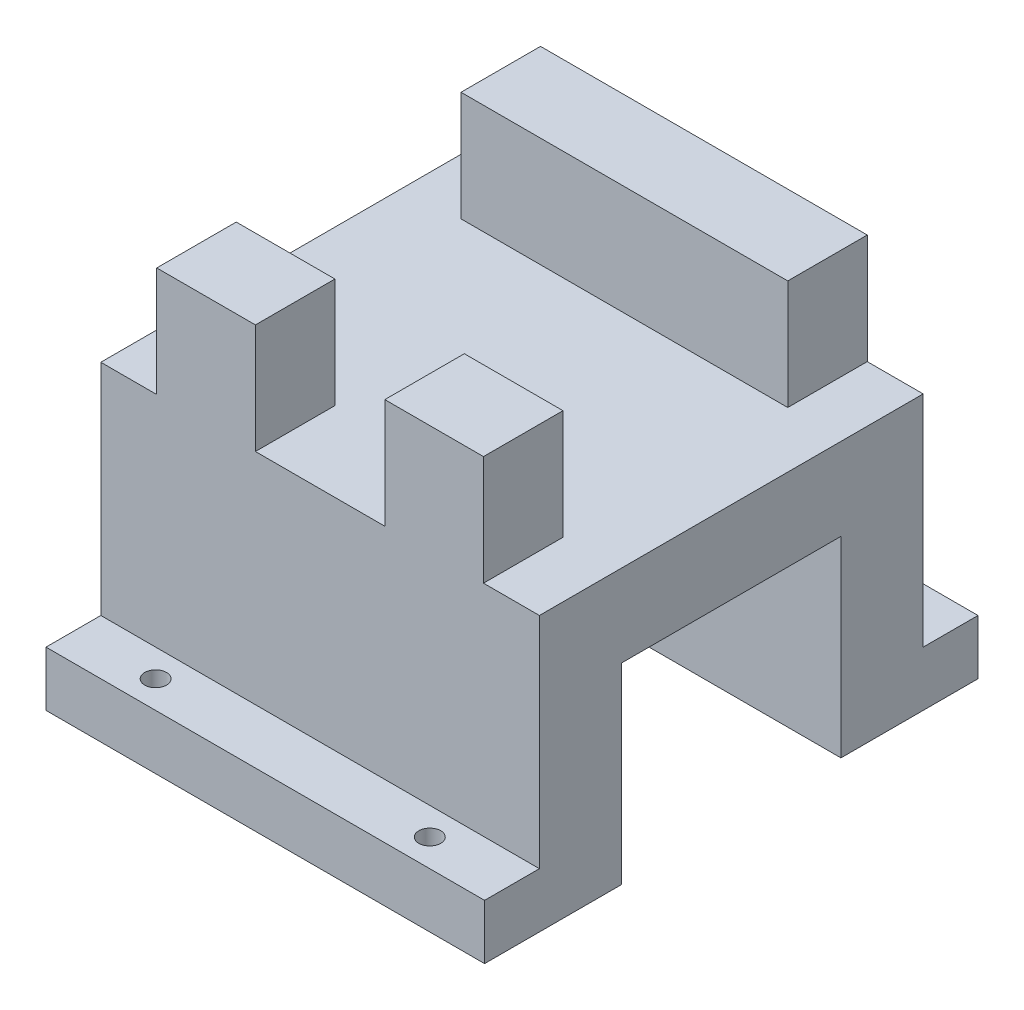
ISO-10303-21;
HEADER;
FILE_DESCRIPTION(('STEP AP214'),'2;1');
FILE_NAME('part.step','',(''),(''),'','','');
FILE_SCHEMA(('AUTOMOTIVE_DESIGN { 1 0 10303 214 1 1 1 1 }'));
ENDSEC;
DATA;
#1=APPLICATION_CONTEXT('core data for automotive mechanical design processes');
#2=APPLICATION_PROTOCOL_DEFINITION('international standard','automotive_design',2000,#1);
#3=PRODUCT_CONTEXT('',#1,'mechanical');
#4=PRODUCT('Part','Part','',(#3));
#5=PRODUCT_RELATED_PRODUCT_CATEGORY('part','',(#4));
#6=PRODUCT_DEFINITION_FORMATION('','',#4);
#7=PRODUCT_DEFINITION_CONTEXT('part definition',#1,'design');
#8=PRODUCT_DEFINITION('design','',#6,#7);
#9=PRODUCT_DEFINITION_SHAPE('','',#8);
#10=(LENGTH_UNIT() NAMED_UNIT(*) SI_UNIT(.MILLI.,.METRE.));
#11=(NAMED_UNIT(*) PLANE_ANGLE_UNIT() SI_UNIT($,.RADIAN.));
#12=(NAMED_UNIT(*) SI_UNIT($,.STERADIAN.) SOLID_ANGLE_UNIT());
#13=UNCERTAINTY_MEASURE_WITH_UNIT(LENGTH_MEASURE(1.E-05),#10,'distance_accuracy_value','');
#14=(GEOMETRIC_REPRESENTATION_CONTEXT(3) GLOBAL_UNCERTAINTY_ASSIGNED_CONTEXT((#13)) GLOBAL_UNIT_ASSIGNED_CONTEXT((#10,
#11,#12)) REPRESENTATION_CONTEXT('',''));
#15=CARTESIAN_POINT('',(0.,0.,0.));
#16=DIRECTION('',(0.,0.,1.));
#17=DIRECTION('',(1.,0.,0.));
#18=AXIS2_PLACEMENT_3D('',#15,#16,#17);
#19=CARTESIAN_POINT('',(0.,0.,0.));
#20=DIRECTION('',(0.,-1.,0.));
#21=DIRECTION('',(0.,0.,-1.));
#22=AXIS2_PLACEMENT_3D('',#19,#20,#21);
#23=PLANE('',#22);
#24=CARTESIAN_POINT('',(-25.,0.,-40.));
#25=DIRECTION('',(0.,-1.,0.));
#26=DIRECTION('',(0.,0.,-1.));
#27=AXIS2_PLACEMENT_3D('',#24,#25,#26);
#28=CIRCLE('',#27,2.);
#29=CARTESIAN_POINT('',(-25.,0.,-42.));
#30=VERTEX_POINT('',#29);
#31=EDGE_CURVE('E442',#30,#30,#28,.F.);
#32=ORIENTED_EDGE('',*,*,#31,.T.);
#33=EDGE_LOOP('',(#32));
#34=FACE_BOUND('',#33,.T.);
#35=CARTESIAN_POINT('',(25.,0.,-40.));
#36=DIRECTION('',(0.,-1.,0.));
#37=DIRECTION('',(0.,0.,-1.));
#38=AXIS2_PLACEMENT_3D('',#35,#36,#37);
#39=CIRCLE('',#38,2.);
#40=CARTESIAN_POINT('',(25.,0.,-42.));
#41=VERTEX_POINT('',#40);
#42=EDGE_CURVE('E447',#41,#41,#39,.F.);
#43=ORIENTED_EDGE('',*,*,#42,.T.);
#44=EDGE_LOOP('',(#43));
#45=FACE_BOUND('',#44,.T.);
#46=DIRECTION('',(-1.,0.,0.));
#47=VECTOR('',#46,1.);
#48=CARTESIAN_POINT('',(40.001,0.,-20.));
#49=LINE('',#48,#47);
#50=CARTESIAN_POINT('',(40.,0.,-20.));
#51=VERTEX_POINT('',#50);
#52=CARTESIAN_POINT('',(-40.,0.,-20.));
#53=VERTEX_POINT('',#52);
#54=EDGE_CURVE('E195',#51,#53,#49,.T.);
#55=ORIENTED_EDGE('',*,*,#54,.T.);
#56=DIRECTION('',(0.,0.,1.));
#57=VECTOR('',#56,1.);
#58=CARTESIAN_POINT('',(-40.,0.,-45.));
#59=LINE('',#58,#57);
#60=CARTESIAN_POINT('',(-40.,0.,-45.));
#61=VERTEX_POINT('',#60);
#62=EDGE_CURVE('E223',#61,#53,#59,.T.);
#63=ORIENTED_EDGE('',*,*,#62,.F.);
#64=DIRECTION('',(-1.,0.,0.));
#65=VECTOR('',#64,1.);
#66=CARTESIAN_POINT('',(40.,0.,-45.));
#67=LINE('',#66,#65);
#68=CARTESIAN_POINT('',(40.,0.,-45.));
#69=VERTEX_POINT('',#68);
#70=EDGE_CURVE('E218',#69,#61,#67,.T.);
#71=ORIENTED_EDGE('',*,*,#70,.F.);
#72=DIRECTION('',(0.,0.,-1.));
#73=VECTOR('',#72,1.);
#74=CARTESIAN_POINT('',(40.,0.,-45.));
#75=LINE('',#74,#73);
#76=EDGE_CURVE('E212',#51,#69,#75,.T.);
#77=ORIENTED_EDGE('',*,*,#76,.F.);
#78=EDGE_LOOP('',(#55,#63,#71,#77));
#79=FACE_BOUND('',#78,.T.);
#80=ADVANCED_FACE('F34',(#34,#45,#79),#23,.T.);
#81=CARTESIAN_POINT('',(-29.8,70.,20.5));
#82=DIRECTION('',(0.,0.,1.));
#83=DIRECTION('',(1.,0.,0.));
#84=AXIS2_PLACEMENT_3D('',#81,#82,#83);
#85=PLANE('',#84);
#86=DIRECTION('',(-1.,0.,0.));
#87=VECTOR('',#86,1.);
#88=CARTESIAN_POINT('',(-29.8,70.,20.5));
#89=LINE('',#88,#87);
#90=CARTESIAN_POINT('',(-11.8,70.,20.5));
#91=VERTEX_POINT('',#90);
#92=CARTESIAN_POINT('',(-29.8,70.,20.5));
#93=VERTEX_POINT('',#92);
#94=EDGE_CURVE('E316',#91,#93,#89,.T.);
#95=ORIENTED_EDGE('',*,*,#94,.F.);
#96=DIRECTION('',(0.,1.,0.));
#97=VECTOR('',#96,1.);
#98=CARTESIAN_POINT('',(-11.8,70.,20.5));
#99=LINE('',#98,#97);
#100=CARTESIAN_POINT('',(-11.8,50.,20.5));
#101=VERTEX_POINT('',#100);
#102=EDGE_CURVE('E258',#101,#91,#99,.T.);
#103=ORIENTED_EDGE('',*,*,#102,.F.);
#104=DIRECTION('',(-1.,0.,0.));
#105=VECTOR('',#104,1.);
#106=CARTESIAN_POINT('',(-29.8,50.,20.5));
#107=LINE('',#106,#105);
#108=CARTESIAN_POINT('',(-29.8,50.,20.5));
#109=VERTEX_POINT('',#108);
#110=EDGE_CURVE('E326',#101,#109,#107,.T.);
#111=ORIENTED_EDGE('',*,*,#110,.T.);
#112=DIRECTION('',(0.,-1.,0.));
#113=VECTOR('',#112,1.);
#114=CARTESIAN_POINT('',(-29.8,70.,20.5));
#115=LINE('',#114,#113);
#116=EDGE_CURVE('E320',#93,#109,#115,.T.);
#117=ORIENTED_EDGE('',*,*,#116,.F.);
#118=EDGE_LOOP('',(#95,#103,#111,#117));
#119=FACE_BOUND('',#118,.T.);
#120=ADVANCED_FACE('F399',(#119),#85,.F.);
#121=CARTESIAN_POINT('',(0.,70.,0.));
#122=DIRECTION('',(0.,-1.,0.));
#123=DIRECTION('',(0.,0.,-1.));
#124=AXIS2_PLACEMENT_3D('',#121,#122,#123);
#125=PLANE('',#124);
#126=DIRECTION('',(1.,0.,0.));
#127=VECTOR('',#126,1.);
#128=CARTESIAN_POINT('',(-29.8,70.,35.));
#129=LINE('',#128,#127);
#130=CARTESIAN_POINT('',(-29.8,70.,35.));
#131=VERTEX_POINT('',#130);
#132=CARTESIAN_POINT('',(-11.8,70.,35.));
#133=VERTEX_POINT('',#132);
#134=EDGE_CURVE('E311',#131,#133,#129,.T.);
#135=ORIENTED_EDGE('',*,*,#134,.T.);
#136=DIRECTION('',(0.,0.,1.));
#137=VECTOR('',#136,1.);
#138=CARTESIAN_POINT('',(-11.8,70.,-45.001));
#139=LINE('',#138,#137);
#140=EDGE_CURVE('E268',#91,#133,#139,.T.);
#141=ORIENTED_EDGE('',*,*,#140,.F.);
#142=ORIENTED_EDGE('',*,*,#94,.T.);
#143=DIRECTION('',(0.,0.,1.));
#144=VECTOR('',#143,1.);
#145=CARTESIAN_POINT('',(-29.8,70.,35.));
#146=LINE('',#145,#144);
#147=EDGE_CURVE('E306',#93,#131,#146,.T.);
#148=ORIENTED_EDGE('',*,*,#147,.T.);
#149=EDGE_LOOP('',(#135,#141,#142,#148));
#150=FACE_BOUND('',#149,.T.);
#151=ADVANCED_FACE('F405',(#150),#125,.F.);
#152=CARTESIAN_POINT('',(0.,50.,0.));
#153=DIRECTION('',(0.,-1.,0.));
#154=DIRECTION('',(0.,0.,-1.));
#155=AXIS2_PLACEMENT_3D('',#152,#153,#154);
#156=PLANE('',#155);
#157=DIRECTION('',(0.,0.,1.));
#158=VECTOR('',#157,1.);
#159=CARTESIAN_POINT('',(-29.8,50.,-35.));
#160=LINE('',#159,#158);
#161=CARTESIAN_POINT('',(-29.8,50.,-35.));
#162=VERTEX_POINT('',#161);
#163=CARTESIAN_POINT('',(-29.8,50.,-20.5));
#164=VERTEX_POINT('',#163);
#165=EDGE_CURVE('E270',#162,#164,#160,.T.);
#166=ORIENTED_EDGE('',*,*,#165,.F.);
#167=DIRECTION('',(-1.,0.,0.));
#168=VECTOR('',#167,1.);
#169=CARTESIAN_POINT('',(40.,50.,-35.));
#170=LINE('',#169,#168);
#171=CARTESIAN_POINT('',(-40.,50.,-35.));
#172=VERTEX_POINT('',#171);
#173=EDGE_CURVE('E350',#162,#172,#170,.T.);
#174=ORIENTED_EDGE('',*,*,#173,.T.);
#175=DIRECTION('',(0.,0.,1.));
#176=VECTOR('',#175,1.);
#177=CARTESIAN_POINT('',(-40.,50.,-35.));
#178=LINE('',#177,#176);
#179=CARTESIAN_POINT('',(-40.,50.,35.));
#180=VERTEX_POINT('',#179);
#181=EDGE_CURVE('E341',#172,#180,#178,.T.);
#182=ORIENTED_EDGE('',*,*,#181,.T.);
#183=DIRECTION('',(1.,0.,0.));
#184=VECTOR('',#183,1.);
#185=CARTESIAN_POINT('',(40.,50.,35.));
#186=LINE('',#185,#184);
#187=CARTESIAN_POINT('',(-29.8,50.,35.));
#188=VERTEX_POINT('',#187);
#189=EDGE_CURVE('E346',#180,#188,#186,.T.);
#190=ORIENTED_EDGE('',*,*,#189,.T.);
#191=DIRECTION('',(0.,0.,1.));
#192=VECTOR('',#191,1.);
#193=CARTESIAN_POINT('',(-29.8,50.,35.));
#194=LINE('',#193,#192);
#195=EDGE_CURVE('E305',#109,#188,#194,.T.);
#196=ORIENTED_EDGE('',*,*,#195,.F.);
#197=ORIENTED_EDGE('',*,*,#110,.F.);
#198=DIRECTION('',(0.,0.,1.));
#199=VECTOR('',#198,1.);
#200=CARTESIAN_POINT('',(-11.8,50.,-45.001));
#201=LINE('',#200,#199);
#202=CARTESIAN_POINT('',(-11.8,50.,35.));
#203=VERTEX_POINT('',#202);
#204=EDGE_CURVE('E267',#101,#203,#201,.T.);
#205=ORIENTED_EDGE('',*,*,#204,.T.);
#206=DIRECTION('',(1.,0.,0.));
#207=VECTOR('',#206,1.);
#208=CARTESIAN_POINT('',(-11.8,50.,35.));
#209=LINE('',#208,#207);
#210=CARTESIAN_POINT('',(11.8,50.,35.));
#211=VERTEX_POINT('',#210);
#212=EDGE_CURVE('E263',#203,#211,#209,.T.);
#213=ORIENTED_EDGE('',*,*,#212,.T.);
#214=DIRECTION('',(0.,0.,1.));
#215=VECTOR('',#214,1.);
#216=CARTESIAN_POINT('',(11.8,50.,-45.001));
#217=LINE('',#216,#215);
#218=CARTESIAN_POINT('',(11.8,50.,20.5));
#219=VERTEX_POINT('',#218);
#220=EDGE_CURVE('E273',#219,#211,#217,.T.);
#221=ORIENTED_EDGE('',*,*,#220,.F.);
#222=CARTESIAN_POINT('',(29.8,50.,20.5));
#223=VERTEX_POINT('',#222);
#224=EDGE_CURVE('E310',#223,#219,#107,.T.);
#225=ORIENTED_EDGE('',*,*,#224,.F.);
#226=DIRECTION('',(0.,0.,-1.));
#227=VECTOR('',#226,1.);
#228=CARTESIAN_POINT('',(29.8,50.,35.));
#229=LINE('',#228,#227);
#230=CARTESIAN_POINT('',(29.8,50.,35.));
#231=VERTEX_POINT('',#230);
#232=EDGE_CURVE('E323',#231,#223,#229,.T.);
#233=ORIENTED_EDGE('',*,*,#232,.F.);
#234=CARTESIAN_POINT('',(40.,50.,35.));
#235=VERTEX_POINT('',#234);
#236=EDGE_CURVE('E344',#231,#235,#186,.T.);
#237=ORIENTED_EDGE('',*,*,#236,.T.);
#238=DIRECTION('',(0.,0.,-1.));
#239=VECTOR('',#238,1.);
#240=CARTESIAN_POINT('',(40.,50.,-35.));
#241=LINE('',#240,#239);
#242=CARTESIAN_POINT('',(40.,50.,-35.));
#243=VERTEX_POINT('',#242);
#244=EDGE_CURVE('E348',#235,#243,#241,.T.);
#245=ORIENTED_EDGE('',*,*,#244,.T.);
#246=CARTESIAN_POINT('',(29.8,50.,-35.));
#247=VERTEX_POINT('',#246);
#248=EDGE_CURVE('E351',#243,#247,#170,.T.);
#249=ORIENTED_EDGE('',*,*,#248,.T.);
#250=DIRECTION('',(0.,0.,-1.));
#251=VECTOR('',#250,1.);
#252=CARTESIAN_POINT('',(29.8,50.,-35.));
#253=LINE('',#252,#251);
#254=CARTESIAN_POINT('',(29.8,50.,-20.5));
#255=VERTEX_POINT('',#254);
#256=EDGE_CURVE('E280',#255,#247,#253,.T.);
#257=ORIENTED_EDGE('',*,*,#256,.F.);
#258=DIRECTION('',(1.,0.,0.));
#259=VECTOR('',#258,1.);
#260=CARTESIAN_POINT('',(-29.8,50.,-20.5));
#261=LINE('',#260,#259);
#262=EDGE_CURVE('E289',#164,#255,#261,.T.);
#263=ORIENTED_EDGE('',*,*,#262,.F.);
#264=EDGE_LOOP('',(#166,#174,#182,#190,#196,#197,#205,#213,#221,#225,#233,#237,#245,#249,#257,#263));
#265=FACE_BOUND('',#264,.T.);
#266=ADVANCED_FACE('F461',(#265),#156,.F.);
#267=CARTESIAN_POINT('',(0.,10.,0.));
#268=DIRECTION('',(0.,-1.,0.));
#269=DIRECTION('',(0.,0.,-1.));
#270=AXIS2_PLACEMENT_3D('',#267,#268,#269);
#271=PLANE('',#270);
#272=CARTESIAN_POINT('',(-25.,10.,-40.));
#273=DIRECTION('',(0.,1.,0.));
#274=DIRECTION('',(0.,0.,1.));
#275=AXIS2_PLACEMENT_3D('',#272,#273,#274);
#276=CIRCLE('',#275,2.);
#277=CARTESIAN_POINT('',(-25.,10.,-38.));
#278=VERTEX_POINT('',#277);
#279=EDGE_CURVE('E444',#278,#278,#276,.T.);
#280=ORIENTED_EDGE('',*,*,#279,.F.);
#281=EDGE_LOOP('',(#280));
#282=FACE_BOUND('',#281,.T.);
#283=CARTESIAN_POINT('',(25.,10.,-40.));
#284=DIRECTION('',(0.,1.,0.));
#285=DIRECTION('',(0.,0.,1.));
#286=AXIS2_PLACEMENT_3D('',#283,#284,#285);
#287=CIRCLE('',#286,2.);
#288=CARTESIAN_POINT('',(25.,10.,-38.));
#289=VERTEX_POINT('',#288);
#290=EDGE_CURVE('E450',#289,#289,#287,.T.);
#291=ORIENTED_EDGE('',*,*,#290,.F.);
#292=EDGE_LOOP('',(#291));
#293=FACE_BOUND('',#292,.T.);
#294=DIRECTION('',(-1.,0.,0.));
#295=VECTOR('',#294,1.);
#296=CARTESIAN_POINT('',(40.,10.,-35.));
#297=LINE('',#296,#295);
#298=CARTESIAN_POINT('',(40.,10.,-35.));
#299=VERTEX_POINT('',#298);
#300=CARTESIAN_POINT('',(-40.,10.,-35.));
#301=VERTEX_POINT('',#300);
#302=EDGE_CURVE('E345',#299,#301,#297,.T.);
#303=ORIENTED_EDGE('',*,*,#302,.F.);
#304=DIRECTION('',(0.,0.,-1.));
#305=VECTOR('',#304,1.);
#306=CARTESIAN_POINT('',(40.,10.,-45.));
#307=LINE('',#306,#305);
#308=CARTESIAN_POINT('',(40.,10.,-45.));
#309=VERTEX_POINT('',#308);
#310=EDGE_CURVE('E372',#299,#309,#307,.T.);
#311=ORIENTED_EDGE('',*,*,#310,.T.);
#312=DIRECTION('',(-1.,0.,0.));
#313=VECTOR('',#312,1.);
#314=CARTESIAN_POINT('',(40.,10.,-45.));
#315=LINE('',#314,#313);
#316=CARTESIAN_POINT('',(-40.,10.,-45.));
#317=VERTEX_POINT('',#316);
#318=EDGE_CURVE('E233',#309,#317,#315,.T.);
#319=ORIENTED_EDGE('',*,*,#318,.T.);
#320=DIRECTION('',(0.,0.,1.));
#321=VECTOR('',#320,1.);
#322=CARTESIAN_POINT('',(-40.,10.,-45.));
#323=LINE('',#322,#321);
#324=EDGE_CURVE('E368',#317,#301,#323,.T.);
#325=ORIENTED_EDGE('',*,*,#324,.T.);
#326=EDGE_LOOP('',(#303,#311,#319,#325));
#327=FACE_BOUND('',#326,.T.);
#328=ADVANCED_FACE('F457',(#282,#293,#327),#271,.F.);
#329=CARTESIAN_POINT('',(25.,10.,40.));
#330=DIRECTION('',(0.,1.,0.));
#331=DIRECTION('',(0.,0.,1.));
#332=AXIS2_PLACEMENT_3D('',#329,#330,#331);
#333=CIRCLE('',#332,2.);
#334=CARTESIAN_POINT('',(25.,10.,42.));
#335=VERTEX_POINT('',#334);
#336=EDGE_CURVE('E433',#335,#335,#333,.T.);
#337=ORIENTED_EDGE('',*,*,#336,.F.);
#338=EDGE_LOOP('',(#337));
#339=FACE_BOUND('',#338,.T.);
#340=CARTESIAN_POINT('',(-25.,10.,40.));
#341=DIRECTION('',(0.,1.,0.));
#342=DIRECTION('',(0.,0.,1.));
#343=AXIS2_PLACEMENT_3D('',#340,#341,#342);
#344=CIRCLE('',#343,2.00000000000001);
#345=CARTESIAN_POINT('',(-25.,10.,42.));
#346=VERTEX_POINT('',#345);
#347=EDGE_CURVE('E432',#346,#346,#344,.T.);
#348=ORIENTED_EDGE('',*,*,#347,.F.);
#349=EDGE_LOOP('',(#348));
#350=FACE_BOUND('',#349,.T.);
#351=DIRECTION('',(1.,0.,0.));
#352=VECTOR('',#351,1.);
#353=CARTESIAN_POINT('',(40.,10.,35.));
#354=LINE('',#353,#352);
#355=CARTESIAN_POINT('',(-40.,10.,35.));
#356=VERTEX_POINT('',#355);
#357=CARTESIAN_POINT('',(40.,10.,35.));
#358=VERTEX_POINT('',#357);
#359=EDGE_CURVE('E340',#356,#358,#354,.T.);
#360=ORIENTED_EDGE('',*,*,#359,.F.);
#361=CARTESIAN_POINT('',(-40.,10.,45.));
#362=VERTEX_POINT('',#361);
#363=EDGE_CURVE('E228',#356,#362,#323,.T.);
#364=ORIENTED_EDGE('',*,*,#363,.T.);
#365=DIRECTION('',(1.,0.,0.));
#366=VECTOR('',#365,1.);
#367=CARTESIAN_POINT('',(40.,10.,45.));
#368=LINE('',#367,#366);
#369=CARTESIAN_POINT('',(40.,10.,45.));
#370=VERTEX_POINT('',#369);
#371=EDGE_CURVE('E370',#362,#370,#368,.T.);
#372=ORIENTED_EDGE('',*,*,#371,.T.);
#373=EDGE_CURVE('E239',#370,#358,#307,.T.);
#374=ORIENTED_EDGE('',*,*,#373,.T.);
#375=EDGE_LOOP('',(#360,#364,#372,#374));
#376=FACE_BOUND('',#375,.T.);
#377=ADVANCED_FACE('F460',(#339,#350,#376),#271,.F.);
#378=CARTESIAN_POINT('',(-40.,10.,-45.));
#379=DIRECTION('',(1.,0.,0.));
#380=DIRECTION('',(0.,0.,-1.));
#381=AXIS2_PLACEMENT_3D('',#378,#379,#380);
#382=PLANE('',#381);
#383=ORIENTED_EDGE('',*,*,#62,.T.);
#384=DIRECTION('',(0.,-1.,0.));
#385=VECTOR('',#384,1.);
#386=CARTESIAN_POINT('',(-40.,0.,-20.));
#387=LINE('',#386,#385);
#388=CARTESIAN_POINT('',(-40.,35.,-20.));
#389=VERTEX_POINT('',#388);
#390=EDGE_CURVE('E201',#389,#53,#387,.T.);
#391=ORIENTED_EDGE('',*,*,#390,.F.);
#392=DIRECTION('',(0.,0.,-1.));
#393=VECTOR('',#392,1.);
#394=CARTESIAN_POINT('',(-40.,35.,-20.));
#395=LINE('',#394,#393);
#396=CARTESIAN_POINT('',(-40.,35.,20.));
#397=VERTEX_POINT('',#396);
#398=EDGE_CURVE('E207',#397,#389,#395,.T.);
#399=ORIENTED_EDGE('',*,*,#398,.F.);
#400=DIRECTION('',(0.,1.,0.));
#401=VECTOR('',#400,1.);
#402=CARTESIAN_POINT('',(-40.,0.,20.));
#403=LINE('',#402,#401);
#404=CARTESIAN_POINT('',(-40.,0.,20.));
#405=VERTEX_POINT('',#404);
#406=EDGE_CURVE('E378',#405,#397,#403,.T.);
#407=ORIENTED_EDGE('',*,*,#406,.F.);
#408=CARTESIAN_POINT('',(-40.,0.,45.));
#409=VERTEX_POINT('',#408);
#410=EDGE_CURVE('E246',#405,#409,#59,.T.);
#411=ORIENTED_EDGE('',*,*,#410,.T.);
#412=DIRECTION('',(0.,-1.,0.));
#413=VECTOR('',#412,1.);
#414=CARTESIAN_POINT('',(-40.,10.,45.));
#415=LINE('',#414,#413);
#416=EDGE_CURVE('E11',#362,#409,#415,.T.);
#417=ORIENTED_EDGE('',*,*,#416,.F.);
#418=ORIENTED_EDGE('',*,*,#363,.F.);
#419=DIRECTION('',(0.,-1.,0.));
#420=VECTOR('',#419,1.);
#421=CARTESIAN_POINT('',(-40.,50.,35.));
#422=LINE('',#421,#420);
#423=EDGE_CURVE('E365',#180,#356,#422,.T.);
#424=ORIENTED_EDGE('',*,*,#423,.F.);
#425=ORIENTED_EDGE('',*,*,#181,.F.);
#426=DIRECTION('',(0.,-1.,0.));
#427=VECTOR('',#426,1.);
#428=CARTESIAN_POINT('',(-40.,50.,-35.));
#429=LINE('',#428,#427);
#430=EDGE_CURVE('E353',#172,#301,#429,.T.);
#431=ORIENTED_EDGE('',*,*,#430,.T.);
#432=ORIENTED_EDGE('',*,*,#324,.F.);
#433=DIRECTION('',(0.,-1.,0.));
#434=VECTOR('',#433,1.);
#435=CARTESIAN_POINT('',(-40.,10.,-45.));
#436=LINE('',#435,#434);
#437=EDGE_CURVE('E229',#317,#61,#436,.T.);
#438=ORIENTED_EDGE('',*,*,#437,.T.);
#439=EDGE_LOOP('',(#383,#391,#399,#407,#411,#417,#418,#424,#425,#431,#432,#438));
#440=FACE_BOUND('',#439,.T.);
#441=ADVANCED_FACE('F36',(#440),#382,.F.);
#442=CARTESIAN_POINT('',(40.,10.,45.));
#443=DIRECTION('',(0.,0.,-1.));
#444=DIRECTION('',(-1.,0.,0.));
#445=AXIS2_PLACEMENT_3D('',#442,#443,#444);
#446=PLANE('',#445);
#447=DIRECTION('',(1.,0.,0.));
#448=VECTOR('',#447,1.);
#449=CARTESIAN_POINT('',(40.,0.,45.));
#450=LINE('',#449,#448);
#451=CARTESIAN_POINT('',(40.,0.,45.));
#452=VERTEX_POINT('',#451);
#453=EDGE_CURVE('E220',#409,#452,#450,.T.);
#454=ORIENTED_EDGE('',*,*,#453,.T.);
#455=DIRECTION('',(0.,-1.,0.));
#456=VECTOR('',#455,1.);
#457=CARTESIAN_POINT('',(40.,10.,45.));
#458=LINE('',#457,#456);
#459=EDGE_CURVE('E42',#370,#452,#458,.T.);
#460=ORIENTED_EDGE('',*,*,#459,.F.);
#461=ORIENTED_EDGE('',*,*,#371,.F.);
#462=ORIENTED_EDGE('',*,*,#416,.T.);
#463=EDGE_LOOP('',(#454,#460,#461,#462));
#464=FACE_BOUND('',#463,.T.);
#465=ADVANCED_FACE('F640',(#464),#446,.F.);
#466=CARTESIAN_POINT('',(40.,10.,-45.));
#467=DIRECTION('',(-1.,0.,0.));
#468=DIRECTION('',(0.,0.,1.));
#469=AXIS2_PLACEMENT_3D('',#466,#467,#468);
#470=PLANE('',#469);
#471=DIRECTION('',(0.,0.,1.));
#472=VECTOR('',#471,1.);
#473=CARTESIAN_POINT('',(40.,35.,-20.));
#474=LINE('',#473,#472);
#475=CARTESIAN_POINT('',(40.,35.,-20.));
#476=VERTEX_POINT('',#475);
#477=CARTESIAN_POINT('',(40.,35.,20.));
#478=VERTEX_POINT('',#477);
#479=EDGE_CURVE('E215',#476,#478,#474,.T.);
#480=ORIENTED_EDGE('',*,*,#479,.F.);
#481=DIRECTION('',(0.,1.,0.));
#482=VECTOR('',#481,1.);
#483=CARTESIAN_POINT('',(40.,0.,-20.));
#484=LINE('',#483,#482);
#485=EDGE_CURVE('E198',#51,#476,#484,.T.);
#486=ORIENTED_EDGE('',*,*,#485,.F.);
#487=ORIENTED_EDGE('',*,*,#76,.T.);
#488=DIRECTION('',(0.,-1.,0.));
#489=VECTOR('',#488,1.);
#490=CARTESIAN_POINT('',(40.,10.,-45.));
#491=LINE('',#490,#489);
#492=EDGE_CURVE('E232',#309,#69,#491,.T.);
#493=ORIENTED_EDGE('',*,*,#492,.F.);
#494=ORIENTED_EDGE('',*,*,#310,.F.);
#495=DIRECTION('',(0.,-1.,0.));
#496=VECTOR('',#495,1.);
#497=CARTESIAN_POINT('',(40.,50.,-35.));
#498=LINE('',#497,#496);
#499=EDGE_CURVE('E360',#243,#299,#498,.T.);
#500=ORIENTED_EDGE('',*,*,#499,.F.);
#501=ORIENTED_EDGE('',*,*,#244,.F.);
#502=DIRECTION('',(0.,-1.,0.));
#503=VECTOR('',#502,1.);
#504=CARTESIAN_POINT('',(40.,50.,35.));
#505=LINE('',#504,#503);
#506=EDGE_CURVE('E363',#235,#358,#505,.T.);
#507=ORIENTED_EDGE('',*,*,#506,.T.);
#508=ORIENTED_EDGE('',*,*,#373,.F.);
#509=ORIENTED_EDGE('',*,*,#459,.T.);
#510=CARTESIAN_POINT('',(40.,0.,20.));
#511=VERTEX_POINT('',#510);
#512=EDGE_CURVE('E219',#452,#511,#75,.T.);
#513=ORIENTED_EDGE('',*,*,#512,.T.);
#514=DIRECTION('',(0.,-1.,0.));
#515=VECTOR('',#514,1.);
#516=CARTESIAN_POINT('',(40.,0.,20.));
#517=LINE('',#516,#515);
#518=EDGE_CURVE('E49',#478,#511,#517,.T.);
#519=ORIENTED_EDGE('',*,*,#518,.F.);
#520=EDGE_LOOP('',(#480,#486,#487,#493,#494,#500,#501,#507,#508,#509,#513,#519));
#521=FACE_BOUND('',#520,.T.);
#522=ADVANCED_FACE('F210',(#521),#470,.F.);
#523=CARTESIAN_POINT('',(40.,10.,-45.));
#524=DIRECTION('',(0.,0.,1.));
#525=DIRECTION('',(1.,0.,0.));
#526=AXIS2_PLACEMENT_3D('',#523,#524,#525);
#527=PLANE('',#526);
#528=ORIENTED_EDGE('',*,*,#70,.T.);
#529=ORIENTED_EDGE('',*,*,#437,.F.);
#530=ORIENTED_EDGE('',*,*,#318,.F.);
#531=ORIENTED_EDGE('',*,*,#492,.T.);
#532=EDGE_LOOP('',(#528,#529,#530,#531));
#533=FACE_BOUND('',#532,.T.);
#534=ADVANCED_FACE('F415',(#533),#527,.F.);
#535=CARTESIAN_POINT('',(25.,0.,40.));
#536=DIRECTION('',(0.,-1.,0.));
#537=DIRECTION('',(0.,0.,-1.));
#538=AXIS2_PLACEMENT_3D('',#535,#536,#537);
#539=CIRCLE('',#538,2.);
#540=CARTESIAN_POINT('',(25.,0.,38.));
#541=VERTEX_POINT('',#540);
#542=EDGE_CURVE('E428',#541,#541,#539,.F.);
#543=ORIENTED_EDGE('',*,*,#542,.T.);
#544=EDGE_LOOP('',(#543));
#545=FACE_BOUND('',#544,.T.);
#546=CARTESIAN_POINT('',(-25.,0.,40.));
#547=DIRECTION('',(0.,-1.,0.));
#548=DIRECTION('',(0.,0.,-1.));
#549=AXIS2_PLACEMENT_3D('',#546,#547,#548);
#550=CIRCLE('',#549,2.00000000000001);
#551=CARTESIAN_POINT('',(-25.,0.,38.));
#552=VERTEX_POINT('',#551);
#553=EDGE_CURVE('E431',#552,#552,#550,.F.);
#554=ORIENTED_EDGE('',*,*,#553,.T.);
#555=EDGE_LOOP('',(#554));
#556=FACE_BOUND('',#555,.T.);
#557=DIRECTION('',(-1.,0.,0.));
#558=VECTOR('',#557,1.);
#559=CARTESIAN_POINT('',(40.001,0.,20.));
#560=LINE('',#559,#558);
#561=EDGE_CURVE('E206',#511,#405,#560,.T.);
#562=ORIENTED_EDGE('',*,*,#561,.F.);
#563=ORIENTED_EDGE('',*,*,#512,.F.);
#564=ORIENTED_EDGE('',*,*,#453,.F.);
#565=ORIENTED_EDGE('',*,*,#410,.F.);
#566=EDGE_LOOP('',(#562,#563,#564,#565));
#567=FACE_BOUND('',#566,.T.);
#568=ADVANCED_FACE('F244',(#545,#556,#567),#23,.T.);
#569=CARTESIAN_POINT('',(40.,50.,35.));
#570=DIRECTION('',(0.,0.,-1.));
#571=DIRECTION('',(-1.,0.,0.));
#572=AXIS2_PLACEMENT_3D('',#569,#570,#571);
#573=PLANE('',#572);
#574=ORIENTED_EDGE('',*,*,#212,.F.);
#575=DIRECTION('',(0.,-1.,0.));
#576=VECTOR('',#575,1.);
#577=CARTESIAN_POINT('',(-11.8,70.,35.));
#578=LINE('',#577,#576);
#579=EDGE_CURVE('E260',#133,#203,#578,.T.);
#580=ORIENTED_EDGE('',*,*,#579,.F.);
#581=ORIENTED_EDGE('',*,*,#134,.F.);
#582=DIRECTION('',(0.,-1.,0.));
#583=VECTOR('',#582,1.);
#584=CARTESIAN_POINT('',(-29.8,70.,35.));
#585=LINE('',#584,#583);
#586=EDGE_CURVE('E337',#131,#188,#585,.T.);
#587=ORIENTED_EDGE('',*,*,#586,.T.);
#588=ORIENTED_EDGE('',*,*,#189,.F.);
#589=ORIENTED_EDGE('',*,*,#423,.T.);
#590=ORIENTED_EDGE('',*,*,#359,.T.);
#591=ORIENTED_EDGE('',*,*,#506,.F.);
#592=ORIENTED_EDGE('',*,*,#236,.F.);
#593=DIRECTION('',(0.,-1.,0.));
#594=VECTOR('',#593,1.);
#595=CARTESIAN_POINT('',(29.8,70.,35.));
#596=LINE('',#595,#594);
#597=CARTESIAN_POINT('',(29.8,70.,35.));
#598=VERTEX_POINT('',#597);
#599=EDGE_CURVE('E334',#598,#231,#596,.T.);
#600=ORIENTED_EDGE('',*,*,#599,.F.);
#601=CARTESIAN_POINT('',(11.8,70.,35.));
#602=VERTEX_POINT('',#601);
#603=EDGE_CURVE('E309',#602,#598,#129,.T.);
#604=ORIENTED_EDGE('',*,*,#603,.F.);
#605=DIRECTION('',(0.,1.,0.));
#606=VECTOR('',#605,1.);
#607=CARTESIAN_POINT('',(11.8,70.,35.));
#608=LINE('',#607,#606);
#609=EDGE_CURVE('E57',#211,#602,#608,.T.);
#610=ORIENTED_EDGE('',*,*,#609,.F.);
#611=EDGE_LOOP('',(#574,#580,#581,#587,#588,#589,#590,#591,#592,#600,#604,#610));
#612=FACE_BOUND('',#611,.T.);
#613=ADVANCED_FACE('F414',(#612),#573,.F.);
#614=CARTESIAN_POINT('',(40.,50.,-35.));
#615=DIRECTION('',(0.,0.,1.));
#616=DIRECTION('',(1.,0.,0.));
#617=AXIS2_PLACEMENT_3D('',#614,#615,#616);
#618=PLANE('',#617);
#619=ORIENTED_EDGE('',*,*,#302,.T.);
#620=ORIENTED_EDGE('',*,*,#430,.F.);
#621=ORIENTED_EDGE('',*,*,#173,.F.);
#622=DIRECTION('',(0.,-1.,0.));
#623=VECTOR('',#622,1.);
#624=CARTESIAN_POINT('',(-29.8,70.,-35.));
#625=LINE('',#624,#623);
#626=CARTESIAN_POINT('',(-29.8,70.,-35.));
#627=VERTEX_POINT('',#626);
#628=EDGE_CURVE('E286',#627,#162,#625,.T.);
#629=ORIENTED_EDGE('',*,*,#628,.F.);
#630=DIRECTION('',(-1.,0.,0.));
#631=VECTOR('',#630,1.);
#632=CARTESIAN_POINT('',(-29.8,70.,-35.));
#633=LINE('',#632,#631);
#634=CARTESIAN_POINT('',(29.8,70.,-35.));
#635=VERTEX_POINT('',#634);
#636=EDGE_CURVE('E284',#635,#627,#633,.T.);
#637=ORIENTED_EDGE('',*,*,#636,.F.);
#638=DIRECTION('',(0.,-1.,0.));
#639=VECTOR('',#638,1.);
#640=CARTESIAN_POINT('',(29.8,70.,-35.));
#641=LINE('',#640,#639);
#642=EDGE_CURVE('E296',#635,#247,#641,.T.);
#643=ORIENTED_EDGE('',*,*,#642,.T.);
#644=ORIENTED_EDGE('',*,*,#248,.F.);
#645=ORIENTED_EDGE('',*,*,#499,.T.);
#646=EDGE_LOOP('',(#619,#620,#621,#629,#637,#643,#644,#645));
#647=FACE_BOUND('',#646,.T.);
#648=ADVANCED_FACE('F421',(#647),#618,.F.);
#649=CARTESIAN_POINT('',(-29.8,70.,35.));
#650=DIRECTION('',(1.,0.,0.));
#651=DIRECTION('',(0.,0.,-1.));
#652=AXIS2_PLACEMENT_3D('',#649,#650,#651);
#653=PLANE('',#652);
#654=ORIENTED_EDGE('',*,*,#195,.T.);
#655=ORIENTED_EDGE('',*,*,#586,.F.);
#656=ORIENTED_EDGE('',*,*,#147,.F.);
#657=ORIENTED_EDGE('',*,*,#116,.T.);
#658=EDGE_LOOP('',(#654,#655,#656,#657));
#659=FACE_BOUND('',#658,.T.);
#660=ADVANCED_FACE('F495',(#659),#653,.F.);
#661=CARTESIAN_POINT('',(29.8,70.,35.));
#662=DIRECTION('',(-1.,0.,0.));
#663=DIRECTION('',(0.,0.,1.));
#664=AXIS2_PLACEMENT_3D('',#661,#662,#663);
#665=PLANE('',#664);
#666=ORIENTED_EDGE('',*,*,#232,.T.);
#667=DIRECTION('',(0.,-1.,0.));
#668=VECTOR('',#667,1.);
#669=CARTESIAN_POINT('',(29.8,70.,20.5));
#670=LINE('',#669,#668);
#671=CARTESIAN_POINT('',(29.8,70.,20.5));
#672=VERTEX_POINT('',#671);
#673=EDGE_CURVE('E331',#672,#223,#670,.T.);
#674=ORIENTED_EDGE('',*,*,#673,.F.);
#675=DIRECTION('',(0.,0.,-1.));
#676=VECTOR('',#675,1.);
#677=CARTESIAN_POINT('',(29.8,70.,35.));
#678=LINE('',#677,#676);
#679=EDGE_CURVE('E314',#598,#672,#678,.T.);
#680=ORIENTED_EDGE('',*,*,#679,.F.);
#681=ORIENTED_EDGE('',*,*,#599,.T.);
#682=EDGE_LOOP('',(#666,#674,#680,#681));
#683=FACE_BOUND('',#682,.T.);
#684=ADVANCED_FACE('F514',(#683),#665,.F.);
#685=ORIENTED_EDGE('',*,*,#224,.T.);
#686=DIRECTION('',(0.,-1.,0.));
#687=VECTOR('',#686,1.);
#688=CARTESIAN_POINT('',(11.8,70.,20.5));
#689=LINE('',#688,#687);
#690=CARTESIAN_POINT('',(11.8,70.,20.5));
#691=VERTEX_POINT('',#690);
#692=EDGE_CURVE('E255',#691,#219,#689,.T.);
#693=ORIENTED_EDGE('',*,*,#692,.F.);
#694=EDGE_CURVE('E317',#672,#691,#89,.T.);
#695=ORIENTED_EDGE('',*,*,#694,.F.);
#696=ORIENTED_EDGE('',*,*,#673,.T.);
#697=EDGE_LOOP('',(#685,#693,#695,#696));
#698=FACE_BOUND('',#697,.T.);
#699=ADVANCED_FACE('F408',(#698),#85,.F.);
#700=ORIENTED_EDGE('',*,*,#694,.T.);
#701=DIRECTION('',(0.,0.,1.));
#702=VECTOR('',#701,1.);
#703=CARTESIAN_POINT('',(11.8,70.,-45.001));
#704=LINE('',#703,#702);
#705=EDGE_CURVE('E271',#691,#602,#704,.T.);
#706=ORIENTED_EDGE('',*,*,#705,.T.);
#707=ORIENTED_EDGE('',*,*,#603,.T.);
#708=ORIENTED_EDGE('',*,*,#679,.T.);
#709=EDGE_LOOP('',(#700,#706,#707,#708));
#710=FACE_BOUND('',#709,.T.);
#711=ADVANCED_FACE('F507',(#710),#125,.F.);
#712=CARTESIAN_POINT('',(-29.8,70.,-35.));
#713=DIRECTION('',(1.,0.,0.));
#714=DIRECTION('',(0.,0.,-1.));
#715=AXIS2_PLACEMENT_3D('',#712,#713,#714);
#716=PLANE('',#715);
#717=ORIENTED_EDGE('',*,*,#165,.T.);
#718=DIRECTION('',(0.,-1.,0.));
#719=VECTOR('',#718,1.);
#720=CARTESIAN_POINT('',(-29.8,70.,-20.5));
#721=LINE('',#720,#719);
#722=CARTESIAN_POINT('',(-29.8,70.,-20.5));
#723=VERTEX_POINT('',#722);
#724=EDGE_CURVE('E302',#723,#164,#721,.T.);
#725=ORIENTED_EDGE('',*,*,#724,.F.);
#726=DIRECTION('',(0.,0.,1.));
#727=VECTOR('',#726,1.);
#728=CARTESIAN_POINT('',(-29.8,70.,-35.));
#729=LINE('',#728,#727);
#730=EDGE_CURVE('E276',#627,#723,#729,.T.);
#731=ORIENTED_EDGE('',*,*,#730,.F.);
#732=ORIENTED_EDGE('',*,*,#628,.T.);
#733=EDGE_LOOP('',(#717,#725,#731,#732));
#734=FACE_BOUND('',#733,.T.);
#735=ADVANCED_FACE('F485',(#734),#716,.F.);
#736=CARTESIAN_POINT('',(-29.8,70.,-20.5));
#737=DIRECTION('',(0.,0.,-1.));
#738=DIRECTION('',(-1.,0.,0.));
#739=AXIS2_PLACEMENT_3D('',#736,#737,#738);
#740=PLANE('',#739);
#741=ORIENTED_EDGE('',*,*,#262,.T.);
#742=DIRECTION('',(0.,-1.,0.));
#743=VECTOR('',#742,1.);
#744=CARTESIAN_POINT('',(29.8,70.,-20.5));
#745=LINE('',#744,#743);
#746=CARTESIAN_POINT('',(29.8,70.,-20.5));
#747=VERTEX_POINT('',#746);
#748=EDGE_CURVE('E299',#747,#255,#745,.T.);
#749=ORIENTED_EDGE('',*,*,#748,.F.);
#750=DIRECTION('',(1.,0.,0.));
#751=VECTOR('',#750,1.);
#752=CARTESIAN_POINT('',(-29.8,70.,-20.5));
#753=LINE('',#752,#751);
#754=EDGE_CURVE('E279',#723,#747,#753,.T.);
#755=ORIENTED_EDGE('',*,*,#754,.F.);
#756=ORIENTED_EDGE('',*,*,#724,.T.);
#757=EDGE_LOOP('',(#741,#749,#755,#756));
#758=FACE_BOUND('',#757,.T.);
#759=ADVANCED_FACE('F480',(#758),#740,.F.);
#760=CARTESIAN_POINT('',(29.8,70.,-35.));
#761=DIRECTION('',(-1.,0.,0.));
#762=DIRECTION('',(0.,0.,1.));
#763=AXIS2_PLACEMENT_3D('',#760,#761,#762);
#764=PLANE('',#763);
#765=ORIENTED_EDGE('',*,*,#256,.T.);
#766=ORIENTED_EDGE('',*,*,#642,.F.);
#767=DIRECTION('',(0.,0.,-1.));
#768=VECTOR('',#767,1.);
#769=CARTESIAN_POINT('',(29.8,70.,-35.));
#770=LINE('',#769,#768);
#771=EDGE_CURVE('E282',#747,#635,#770,.T.);
#772=ORIENTED_EDGE('',*,*,#771,.F.);
#773=ORIENTED_EDGE('',*,*,#748,.T.);
#774=EDGE_LOOP('',(#765,#766,#772,#773));
#775=FACE_BOUND('',#774,.T.);
#776=ADVANCED_FACE('F476',(#775),#764,.F.);
#777=CARTESIAN_POINT('',(0.,70.,0.));
#778=DIRECTION('',(0.,1.,0.));
#779=DIRECTION('',(0.,0.,1.));
#780=AXIS2_PLACEMENT_3D('',#777,#778,#779);
#781=PLANE('',#780);
#782=ORIENTED_EDGE('',*,*,#730,.T.);
#783=ORIENTED_EDGE('',*,*,#754,.T.);
#784=ORIENTED_EDGE('',*,*,#771,.T.);
#785=ORIENTED_EDGE('',*,*,#636,.T.);
#786=EDGE_LOOP('',(#782,#783,#784,#785));
#787=FACE_BOUND('',#786,.T.);
#788=ADVANCED_FACE('F568',(#787),#781,.T.);
#789=CARTESIAN_POINT('',(-11.8,70.,-45.001));
#790=DIRECTION('',(-1.,0.,0.));
#791=DIRECTION('',(0.,-1.,0.));
#792=AXIS2_PLACEMENT_3D('',#789,#790,#791);
#793=PLANE('',#792);
#794=ORIENTED_EDGE('',*,*,#102,.T.);
#795=ORIENTED_EDGE('',*,*,#140,.T.);
#796=ORIENTED_EDGE('',*,*,#579,.T.);
#797=ORIENTED_EDGE('',*,*,#204,.F.);
#798=EDGE_LOOP('',(#794,#795,#796,#797));
#799=FACE_BOUND('',#798,.T.);
#800=ADVANCED_FACE('F500',(#799),#793,.F.);
#801=CARTESIAN_POINT('',(11.8,70.,-45.001));
#802=DIRECTION('',(1.,0.,0.));
#803=DIRECTION('',(0.,1.,0.));
#804=AXIS2_PLACEMENT_3D('',#801,#802,#803);
#805=PLANE('',#804);
#806=ORIENTED_EDGE('',*,*,#692,.T.);
#807=ORIENTED_EDGE('',*,*,#220,.T.);
#808=ORIENTED_EDGE('',*,*,#609,.T.);
#809=ORIENTED_EDGE('',*,*,#705,.F.);
#810=EDGE_LOOP('',(#806,#807,#808,#809));
#811=FACE_BOUND('',#810,.T.);
#812=ADVANCED_FACE('F511',(#811),#805,.F.);
#813=CARTESIAN_POINT('',(40.001,0.,-20.));
#814=DIRECTION('',(0.,0.,-1.));
#815=DIRECTION('',(-1.,0.,0.));
#816=AXIS2_PLACEMENT_3D('',#813,#814,#815);
#817=PLANE('',#816);
#818=ORIENTED_EDGE('',*,*,#485,.T.);
#819=DIRECTION('',(-1.,0.,0.));
#820=VECTOR('',#819,1.);
#821=CARTESIAN_POINT('',(40.001,35.,-20.));
#822=LINE('',#821,#820);
#823=EDGE_CURVE('E251',#476,#389,#822,.T.);
#824=ORIENTED_EDGE('',*,*,#823,.T.);
#825=ORIENTED_EDGE('',*,*,#390,.T.);
#826=ORIENTED_EDGE('',*,*,#54,.F.);
#827=EDGE_LOOP('',(#818,#824,#825,#826));
#828=FACE_BOUND('',#827,.T.);
#829=ADVANCED_FACE('F197',(#828),#817,.F.);
#830=CARTESIAN_POINT('',(40.001,35.,-20.));
#831=DIRECTION('',(0.,1.,0.));
#832=DIRECTION('',(0.,0.,1.));
#833=AXIS2_PLACEMENT_3D('',#830,#831,#832);
#834=PLANE('',#833);
#835=ORIENTED_EDGE('',*,*,#479,.T.);
#836=DIRECTION('',(-1.,0.,0.));
#837=VECTOR('',#836,1.);
#838=CARTESIAN_POINT('',(40.001,35.,20.));
#839=LINE('',#838,#837);
#840=EDGE_CURVE('E249',#478,#397,#839,.T.);
#841=ORIENTED_EDGE('',*,*,#840,.T.);
#842=ORIENTED_EDGE('',*,*,#398,.T.);
#843=ORIENTED_EDGE('',*,*,#823,.F.);
#844=EDGE_LOOP('',(#835,#841,#842,#843));
#845=FACE_BOUND('',#844,.T.);
#846=ADVANCED_FACE('F384',(#845),#834,.F.);
#847=CARTESIAN_POINT('',(40.001,0.,20.));
#848=DIRECTION('',(0.,0.,1.));
#849=DIRECTION('',(1.,0.,0.));
#850=AXIS2_PLACEMENT_3D('',#847,#848,#849);
#851=PLANE('',#850);
#852=ORIENTED_EDGE('',*,*,#518,.T.);
#853=ORIENTED_EDGE('',*,*,#561,.T.);
#854=ORIENTED_EDGE('',*,*,#406,.T.);
#855=ORIENTED_EDGE('',*,*,#840,.F.);
#856=EDGE_LOOP('',(#852,#853,#854,#855));
#857=FACE_BOUND('',#856,.T.);
#858=ADVANCED_FACE('F385',(#857),#851,.F.);
#859=CARTESIAN_POINT('',(-25.,-0.000999999999999265,40.));
#860=DIRECTION('',(0.,1.,0.));
#861=DIRECTION('',(0.,0.,1.));
#862=AXIS2_PLACEMENT_3D('',#859,#860,#861);
#863=CYLINDRICAL_SURFACE('',#862,2.00000000000001);
#864=ORIENTED_EDGE('',*,*,#553,.F.);
#865=EDGE_LOOP('',(#864));
#866=FACE_BOUND('',#865,.T.);
#867=ORIENTED_EDGE('',*,*,#347,.T.);
#868=EDGE_LOOP('',(#867));
#869=FACE_BOUND('',#868,.T.);
#870=ADVANCED_FACE('F387',(#866,#869),#863,.F.);
#871=CARTESIAN_POINT('',(25.,-0.000999999999999265,40.));
#872=DIRECTION('',(0.,1.,0.));
#873=DIRECTION('',(0.,0.,1.));
#874=AXIS2_PLACEMENT_3D('',#871,#872,#873);
#875=CYLINDRICAL_SURFACE('',#874,2.);
#876=ORIENTED_EDGE('',*,*,#542,.F.);
#877=EDGE_LOOP('',(#876));
#878=FACE_BOUND('',#877,.T.);
#879=ORIENTED_EDGE('',*,*,#336,.T.);
#880=EDGE_LOOP('',(#879));
#881=FACE_BOUND('',#880,.T.);
#882=ADVANCED_FACE('F393',(#878,#881),#875,.F.);
#883=CARTESIAN_POINT('',(25.,-0.000999999999999265,-40.));
#884=DIRECTION('',(0.,1.,0.));
#885=DIRECTION('',(0.,0.,1.));
#886=AXIS2_PLACEMENT_3D('',#883,#884,#885);
#887=CYLINDRICAL_SURFACE('',#886,2.);
#888=ORIENTED_EDGE('',*,*,#42,.F.);
#889=EDGE_LOOP('',(#888));
#890=FACE_BOUND('',#889,.T.);
#891=ORIENTED_EDGE('',*,*,#290,.T.);
#892=EDGE_LOOP('',(#891));
#893=FACE_BOUND('',#892,.T.);
#894=ADVANCED_FACE('F455',(#890,#893),#887,.F.);
#895=CARTESIAN_POINT('',(-25.,-0.000999999999999265,-40.));
#896=DIRECTION('',(0.,1.,0.));
#897=DIRECTION('',(0.,0.,1.));
#898=AXIS2_PLACEMENT_3D('',#895,#896,#897);
#899=CYLINDRICAL_SURFACE('',#898,2.);
#900=ORIENTED_EDGE('',*,*,#31,.F.);
#901=EDGE_LOOP('',(#900));
#902=FACE_BOUND('',#901,.T.);
#903=ORIENTED_EDGE('',*,*,#279,.T.);
#904=EDGE_LOOP('',(#903));
#905=FACE_BOUND('',#904,.T.);
#906=ADVANCED_FACE('F712',(#902,#905),#899,.F.);
#907=CLOSED_SHELL('',(#80,#120,#151,#266,#328,#377,#441,#465,#522,#534,#568,#613,#648,#660,#684,
#699,#711,#735,#759,#776,#788,#800,#812,#829,#846,#858,#870,#882,#894,#906));
#908=MANIFOLD_SOLID_BREP('B2',#907);
#909=ADVANCED_BREP_SHAPE_REPRESENTATION('',(#18,#908),#14);
#910=SHAPE_DEFINITION_REPRESENTATION(#9,#909);
ENDSEC;
END-ISO-10303-21;
